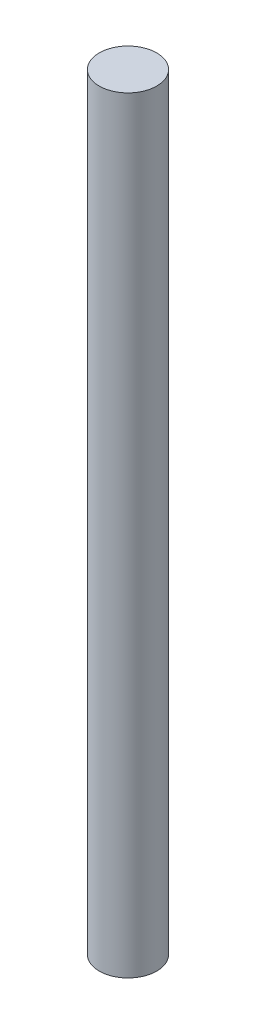
ISO-10303-21;
HEADER;
FILE_DESCRIPTION(('STEP AP214'),'2;1');
FILE_NAME('part.step','',(''),(''),'','','');
FILE_SCHEMA(('AUTOMOTIVE_DESIGN { 1 0 10303 214 1 1 1 1 }'));
ENDSEC;
DATA;
#1=APPLICATION_CONTEXT('core data for automotive mechanical design processes');
#2=APPLICATION_PROTOCOL_DEFINITION('international standard','automotive_design',2000,#1);
#3=PRODUCT_CONTEXT('',#1,'mechanical');
#4=PRODUCT('Part','Part','',(#3));
#5=PRODUCT_RELATED_PRODUCT_CATEGORY('part','',(#4));
#6=PRODUCT_DEFINITION_FORMATION('','',#4);
#7=PRODUCT_DEFINITION_CONTEXT('part definition',#1,'design');
#8=PRODUCT_DEFINITION('design','',#6,#7);
#9=PRODUCT_DEFINITION_SHAPE('','',#8);
#10=(LENGTH_UNIT() NAMED_UNIT(*) SI_UNIT(.MILLI.,.METRE.));
#11=(NAMED_UNIT(*) PLANE_ANGLE_UNIT() SI_UNIT($,.RADIAN.));
#12=(NAMED_UNIT(*) SI_UNIT($,.STERADIAN.) SOLID_ANGLE_UNIT());
#13=UNCERTAINTY_MEASURE_WITH_UNIT(LENGTH_MEASURE(1.E-05),#10,'distance_accuracy_value','');
#14=(GEOMETRIC_REPRESENTATION_CONTEXT(3) GLOBAL_UNCERTAINTY_ASSIGNED_CONTEXT((#13)) GLOBAL_UNIT_ASSIGNED_CONTEXT((#10,
#11,#12)) REPRESENTATION_CONTEXT('',''));
#15=CARTESIAN_POINT('',(0.,0.,0.));
#16=DIRECTION('',(0.,0.,1.));
#17=DIRECTION('',(1.,0.,0.));
#18=AXIS2_PLACEMENT_3D('',#15,#16,#17);
#19=CARTESIAN_POINT('',(0.,200.,0.));
#20=DIRECTION('',(0.,-1.,0.));
#21=DIRECTION('',(0.,0.,-1.));
#22=AXIS2_PLACEMENT_3D('',#19,#20,#21);
#23=CYLINDRICAL_SURFACE('',#22,7.5);
#24=CARTESIAN_POINT('',(0.,200.,0.));
#25=DIRECTION('',(0.,1.,0.));
#26=DIRECTION('',(0.,0.,1.));
#27=AXIS2_PLACEMENT_3D('',#24,#25,#26);
#28=CIRCLE('',#27,7.5);
#29=CARTESIAN_POINT('',(0.,200.,7.5));
#30=VERTEX_POINT('',#29);
#31=EDGE_CURVE('E10',#30,#30,#28,.T.);
#32=ORIENTED_EDGE('',*,*,#31,.F.);
#33=EDGE_LOOP('',(#32));
#34=FACE_BOUND('',#33,.T.);
#35=CARTESIAN_POINT('',(0.,0.,0.));
#36=DIRECTION('',(0.,1.,0.));
#37=DIRECTION('',(0.,0.,1.));
#38=AXIS2_PLACEMENT_3D('',#35,#36,#37);
#39=CIRCLE('',#38,7.5);
#40=CARTESIAN_POINT('',(0.,0.,7.5));
#41=VERTEX_POINT('',#40);
#42=EDGE_CURVE('E33',#41,#41,#39,.T.);
#43=ORIENTED_EDGE('',*,*,#42,.T.);
#44=EDGE_LOOP('',(#43));
#45=FACE_BOUND('',#44,.T.);
#46=ADVANCED_FACE('F30',(#34,#45),#23,.T.);
#47=CARTESIAN_POINT('',(0.,200.,0.));
#48=DIRECTION('',(0.,1.,0.));
#49=DIRECTION('',(0.,0.,1.));
#50=AXIS2_PLACEMENT_3D('',#47,#48,#49);
#51=PLANE('',#50);
#52=ORIENTED_EDGE('',*,*,#31,.T.);
#53=EDGE_LOOP('',(#52));
#54=FACE_BOUND('',#53,.T.);
#55=ADVANCED_FACE('F45',(#54),#51,.T.);
#56=CARTESIAN_POINT('',(0.,0.,0.));
#57=DIRECTION('',(0.,1.,0.));
#58=DIRECTION('',(0.,0.,1.));
#59=AXIS2_PLACEMENT_3D('',#56,#57,#58);
#60=PLANE('',#59);
#61=ORIENTED_EDGE('',*,*,#42,.F.);
#62=EDGE_LOOP('',(#61));
#63=FACE_BOUND('',#62,.T.);
#64=ADVANCED_FACE('F43',(#63),#60,.F.);
#65=CLOSED_SHELL('',(#46,#55,#64));
#66=MANIFOLD_SOLID_BREP('B2',#65);
#67=ADVANCED_BREP_SHAPE_REPRESENTATION('',(#18,#66),#14);
#68=SHAPE_DEFINITION_REPRESENTATION(#9,#67);
ENDSEC;
END-ISO-10303-21;
